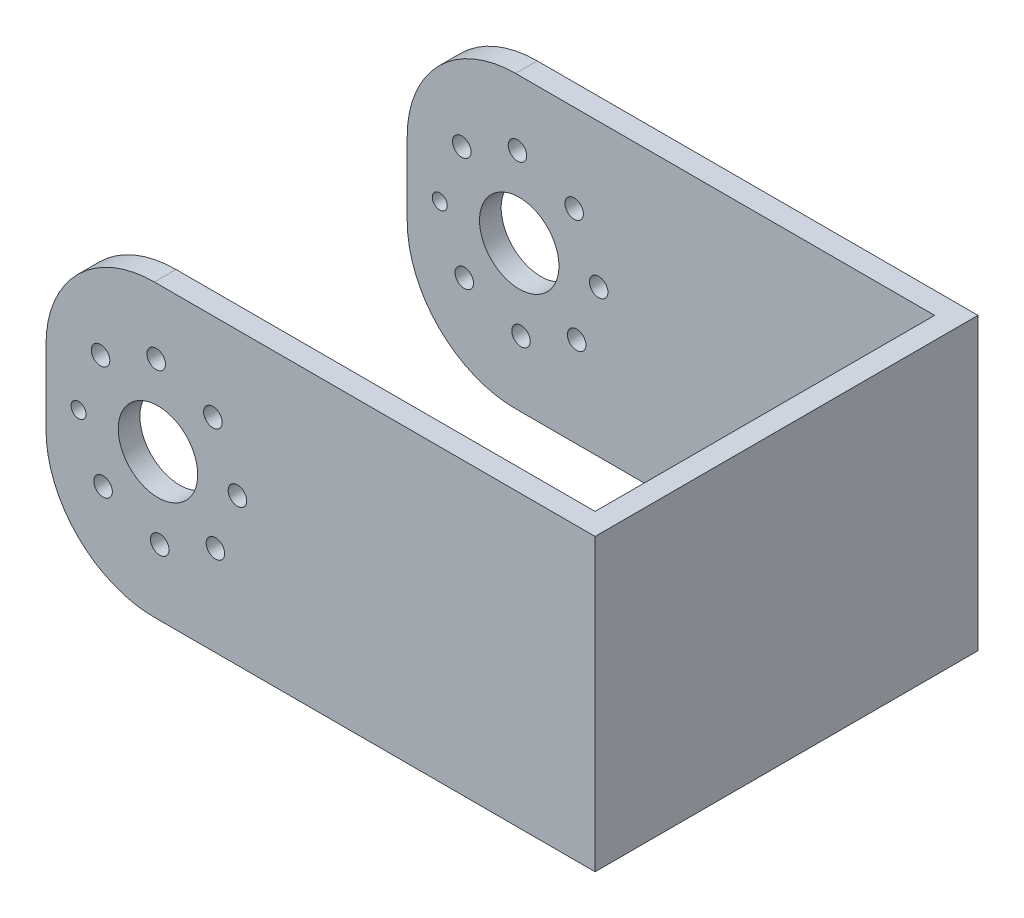
ISO-10303-21;
HEADER;
FILE_DESCRIPTION(('STEP AP214'),'2;1');
FILE_NAME('part.step','',(''),(''),'','','');
FILE_SCHEMA(('AUTOMOTIVE_DESIGN { 1 0 10303 214 1 1 1 1 }'));
ENDSEC;
DATA;
#1=APPLICATION_CONTEXT('core data for automotive mechanical design processes');
#2=APPLICATION_PROTOCOL_DEFINITION('international standard','automotive_design',2000,#1);
#3=PRODUCT_CONTEXT('',#1,'mechanical');
#4=PRODUCT('Part','Part','',(#3));
#5=PRODUCT_RELATED_PRODUCT_CATEGORY('part','',(#4));
#6=PRODUCT_DEFINITION_FORMATION('','',#4);
#7=PRODUCT_DEFINITION_CONTEXT('part definition',#1,'design');
#8=PRODUCT_DEFINITION('design','',#6,#7);
#9=PRODUCT_DEFINITION_SHAPE('','',#8);
#10=(LENGTH_UNIT() NAMED_UNIT(*) SI_UNIT(.MILLI.,.METRE.));
#11=(NAMED_UNIT(*) PLANE_ANGLE_UNIT() SI_UNIT($,.RADIAN.));
#12=(NAMED_UNIT(*) SI_UNIT($,.STERADIAN.) SOLID_ANGLE_UNIT());
#13=UNCERTAINTY_MEASURE_WITH_UNIT(LENGTH_MEASURE(1.E-05),#10,'distance_accuracy_value','');
#14=(GEOMETRIC_REPRESENTATION_CONTEXT(3) GLOBAL_UNCERTAINTY_ASSIGNED_CONTEXT((#13)) GLOBAL_UNIT_ASSIGNED_CONTEXT((#10,
#11,#12)) REPRESENTATION_CONTEXT('',''));
#15=CARTESIAN_POINT('',(0.,0.,0.));
#16=DIRECTION('',(0.,0.,1.));
#17=DIRECTION('',(1.,0.,0.));
#18=AXIS2_PLACEMENT_3D('',#15,#16,#17);
#19=CARTESIAN_POINT('',(0.,40.2,-50.));
#20=DIRECTION('',(0.,0.,1.));
#21=DIRECTION('',(1.,0.,0.));
#22=AXIS2_PLACEMENT_3D('',#19,#20,#21);
#23=PLANE('',#22);
#24=CARTESIAN_POINT('',(15.7463592375308,9.10275911302772,-50.));
#25=DIRECTION('',(0.,0.,1.));
#26=DIRECTION('',(1.,0.,0.));
#27=AXIS2_PLACEMENT_3D('',#24,#25,#26);
#28=CIRCLE('',#27,1.28124999996223);
#29=CARTESIAN_POINT('',(17.027609237493,9.10275911302772,-50.));
#30=VERTEX_POINT('',#29);
#31=EDGE_CURVE('E396',#30,#30,#28,.T.);
#32=ORIENTED_EDGE('',*,*,#31,.F.);
#33=EDGE_LOOP('',(#32));
#34=FACE_BOUND('',#33,.T.);
#35=CARTESIAN_POINT('',(26.4972408869719,20.3463592375301,-50.));
#36=DIRECTION('',(0.,0.,1.));
#37=DIRECTION('',(1.,0.,0.));
#38=AXIS2_PLACEMENT_3D('',#35,#36,#37);
#39=CIRCLE('',#38,1.28124999996223);
#40=CARTESIAN_POINT('',(27.7784908869341,20.3463592375301,-50.));
#41=VERTEX_POINT('',#40);
#42=EDGE_CURVE('E390',#41,#41,#39,.T.);
#43=ORIENTED_EDGE('',*,*,#42,.F.);
#44=EDGE_LOOP('',(#43));
#45=FACE_BOUND('',#44,.T.);
#46=CARTESIAN_POINT('',(23.1020213180539,28.050425892985,-50.));
#47=DIRECTION('',(0.,0.,1.));
#48=DIRECTION('',(1.,0.,0.));
#49=AXIS2_PLACEMENT_3D('',#46,#47,#48);
#50=CIRCLE('',#49,1.28124999996223);
#51=CARTESIAN_POINT('',(24.3832713180162,28.050425892985,-50.));
#52=VERTEX_POINT('',#51);
#53=EDGE_CURVE('E384',#52,#52,#50,.T.);
#54=ORIENTED_EDGE('',*,*,#53,.F.);
#55=EDGE_LOOP('',(#54));
#56=FACE_BOUND('',#55,.T.);
#57=CARTESIAN_POINT('',(15.2536407624695,31.0972408869712,-50.));
#58=DIRECTION('',(0.,0.,1.));
#59=DIRECTION('',(1.,0.,0.));
#60=AXIS2_PLACEMENT_3D('',#57,#58,#59);
#61=CIRCLE('',#60,1.28124999996224);
#62=CARTESIAN_POINT('',(16.5348907624317,31.0972408869712,-50.));
#63=VERTEX_POINT('',#62);
#64=EDGE_CURVE('E378',#63,#63,#61,.T.);
#65=ORIENTED_EDGE('',*,*,#64,.F.);
#66=EDGE_LOOP('',(#65));
#67=FACE_BOUND('',#66,.T.);
#68=CARTESIAN_POINT('',(7.89797868194635,12.1495741070139,-50.));
#69=DIRECTION('',(0.,0.,1.));
#70=DIRECTION('',(1.,0.,0.));
#71=AXIS2_PLACEMENT_3D('',#68,#69,#70);
#72=CIRCLE('',#71,1.28124999996223);
#73=CARTESIAN_POINT('',(9.17922868190858,12.1495741070139,-50.));
#74=VERTEX_POINT('',#73);
#75=EDGE_CURVE('E372',#74,#74,#72,.T.);
#76=ORIENTED_EDGE('',*,*,#75,.F.);
#77=EDGE_LOOP('',(#76));
#78=FACE_BOUND('',#77,.T.);
#79=CARTESIAN_POINT('',(4.50275911302839,19.6078403753859,-50.));
#80=DIRECTION('',(0.,0.,1.));
#81=DIRECTION('',(1.,0.,0.));
#82=AXIS2_PLACEMENT_3D('',#79,#80,#81);
#83=CIRCLE('',#82,1.03544961287929);
#84=CARTESIAN_POINT('',(5.53820872590768,19.6078403753859,-50.));
#85=VERTEX_POINT('',#84);
#86=EDGE_CURVE('E366',#85,#85,#83,.T.);
#87=ORIENTED_EDGE('',*,*,#86,.F.);
#88=EDGE_LOOP('',(#87));
#89=FACE_BOUND('',#88,.T.);
#90=CARTESIAN_POINT('',(7.54957410701459,27.7020213180533,-50.));
#91=DIRECTION('',(0.,0.,1.));
#92=DIRECTION('',(1.,0.,0.));
#93=AXIS2_PLACEMENT_3D('',#90,#91,#92);
#94=CIRCLE('',#93,1.28124999996223);
#95=CARTESIAN_POINT('',(8.83082410697682,27.7020213180533,-50.));
#96=VERTEX_POINT('',#95);
#97=EDGE_CURVE('E360',#96,#96,#94,.T.);
#98=ORIENTED_EDGE('',*,*,#97,.F.);
#99=EDGE_LOOP('',(#98));
#100=FACE_BOUND('',#99,.T.);
#101=CARTESIAN_POINT('',(23.4504258929857,12.4979786819457,-50.));
#102=DIRECTION('',(0.,0.,1.));
#103=DIRECTION('',(1.,0.,0.));
#104=AXIS2_PLACEMENT_3D('',#101,#102,#103);
#105=CIRCLE('',#104,1.28124999996223);
#106=CARTESIAN_POINT('',(24.7316758929479,12.4979786819457,-50.));
#107=VERTEX_POINT('',#106);
#108=EDGE_CURVE('E354',#107,#107,#105,.T.);
#109=ORIENTED_EDGE('',*,*,#108,.F.);
#110=EDGE_LOOP('',(#109));
#111=FACE_BOUND('',#110,.T.);
#112=CARTESIAN_POINT('',(15.5,20.1,-50.));
#113=DIRECTION('',(0.,0.,1.));
#114=DIRECTION('',(1.,0.,0.));
#115=AXIS2_PLACEMENT_3D('',#112,#113,#114);
#116=CIRCLE('',#115,5.5);
#117=CARTESIAN_POINT('',(21.,20.1,-50.));
#118=VERTEX_POINT('',#117);
#119=EDGE_CURVE('E168',#118,#118,#116,.T.);
#120=ORIENTED_EDGE('',*,*,#119,.F.);
#121=EDGE_LOOP('',(#120));
#122=FACE_BOUND('',#121,.T.);
#123=DIRECTION('',(0.,-1.,0.));
#124=VECTOR('',#123,1.);
#125=CARTESIAN_POINT('',(0.,40.2,-50.));
#126=LINE('',#125,#124);
#127=CARTESIAN_POINT('',(0.,25.2,-50.));
#128=VERTEX_POINT('',#127);
#129=CARTESIAN_POINT('',(0.,15.,-50.));
#130=VERTEX_POINT('',#129);
#131=EDGE_CURVE('E165',#128,#130,#126,.T.);
#132=ORIENTED_EDGE('',*,*,#131,.T.);
#133=CARTESIAN_POINT('',(15.,15.,-50.));
#134=DIRECTION('',(0.,0.,1.));
#135=DIRECTION('',(1.,0.,0.));
#136=AXIS2_PLACEMENT_3D('',#133,#134,#135);
#137=CIRCLE('',#136,15.);
#138=CARTESIAN_POINT('',(15.,0.,-50.));
#139=VERTEX_POINT('',#138);
#140=EDGE_CURVE('E219',#130,#139,#137,.T.);
#141=ORIENTED_EDGE('',*,*,#140,.T.);
#142=DIRECTION('',(-1.,0.,0.));
#143=VECTOR('',#142,1.);
#144=CARTESIAN_POINT('',(0.,0.,-50.));
#145=LINE('',#144,#143);
#146=CARTESIAN_POINT('',(73.,0.,-50.));
#147=VERTEX_POINT('',#146);
#148=EDGE_CURVE('E132',#147,#139,#145,.T.);
#149=ORIENTED_EDGE('',*,*,#148,.F.);
#150=DIRECTION('',(0.,-1.,0.));
#151=VECTOR('',#150,1.);
#152=CARTESIAN_POINT('',(73.,40.2,-50.));
#153=LINE('',#152,#151);
#154=CARTESIAN_POINT('',(73.,40.2,-50.));
#155=VERTEX_POINT('',#154);
#156=EDGE_CURVE('E127',#155,#147,#153,.T.);
#157=ORIENTED_EDGE('',*,*,#156,.F.);
#158=DIRECTION('',(-1.,0.,0.));
#159=VECTOR('',#158,1.);
#160=CARTESIAN_POINT('',(0.,40.2,-50.));
#161=LINE('',#160,#159);
#162=CARTESIAN_POINT('',(15.,40.2,-50.));
#163=VERTEX_POINT('',#162);
#164=EDGE_CURVE('E130',#155,#163,#161,.T.);
#165=ORIENTED_EDGE('',*,*,#164,.T.);
#166=CARTESIAN_POINT('',(15.,25.2,-50.));
#167=DIRECTION('',(0.,0.,1.));
#168=DIRECTION('',(1.,0.,0.));
#169=AXIS2_PLACEMENT_3D('',#166,#167,#168);
#170=CIRCLE('',#169,15.);
#171=EDGE_CURVE('E217',#163,#128,#170,.T.);
#172=ORIENTED_EDGE('',*,*,#171,.T.);
#173=EDGE_LOOP('',(#132,#141,#149,#157,#165,#172));
#174=FACE_BOUND('',#173,.T.);
#175=ADVANCED_FACE('F38',(#34,#45,#56,#67,#78,#89,#100,#111,#122,#174),#23,.T.);
#176=CARTESIAN_POINT('',(73.,40.2,0.));
#177=DIRECTION('',(-1.,0.,0.));
#178=DIRECTION('',(0.,0.,1.));
#179=AXIS2_PLACEMENT_3D('',#176,#177,#178);
#180=PLANE('',#179);
#181=DIRECTION('',(0.,0.,-1.));
#182=VECTOR('',#181,1.);
#183=CARTESIAN_POINT('',(73.,0.,0.));
#184=LINE('',#183,#182);
#185=CARTESIAN_POINT('',(73.,0.,-3.));
#186=VERTEX_POINT('',#185);
#187=EDGE_CURVE('E167',#186,#147,#184,.T.);
#188=ORIENTED_EDGE('',*,*,#187,.F.);
#189=DIRECTION('',(0.,-1.,0.));
#190=VECTOR('',#189,1.);
#191=CARTESIAN_POINT('',(73.,40.2,-3.));
#192=LINE('',#191,#190);
#193=CARTESIAN_POINT('',(73.,40.2,-3.));
#194=VERTEX_POINT('',#193);
#195=EDGE_CURVE('E138',#194,#186,#192,.T.);
#196=ORIENTED_EDGE('',*,*,#195,.F.);
#197=DIRECTION('',(0.,0.,-1.));
#198=VECTOR('',#197,1.);
#199=CARTESIAN_POINT('',(73.,40.2,0.));
#200=LINE('',#199,#198);
#201=EDGE_CURVE('E145',#194,#155,#200,.T.);
#202=ORIENTED_EDGE('',*,*,#201,.T.);
#203=ORIENTED_EDGE('',*,*,#156,.T.);
#204=EDGE_LOOP('',(#188,#196,#202,#203));
#205=FACE_BOUND('',#204,.T.);
#206=ADVANCED_FACE('F152',(#205),#180,.T.);
#207=CARTESIAN_POINT('',(0.,40.2,-3.));
#208=DIRECTION('',(0.,0.,-1.));
#209=DIRECTION('',(-1.,0.,0.));
#210=AXIS2_PLACEMENT_3D('',#207,#208,#209);
#211=PLANE('',#210);
#212=CARTESIAN_POINT('',(15.7463592375308,9.10275911302772,-3.));
#213=DIRECTION('',(0.,0.,-1.));
#214=DIRECTION('',(-1.,0.,0.));
#215=AXIS2_PLACEMENT_3D('',#212,#213,#214);
#216=CIRCLE('',#215,1.28124999996223);
#217=CARTESIAN_POINT('',(14.4651092375686,9.10275911302772,-3.));
#218=VERTEX_POINT('',#217);
#219=EDGE_CURVE('E393',#218,#218,#216,.T.);
#220=ORIENTED_EDGE('',*,*,#219,.F.);
#221=EDGE_LOOP('',(#220));
#222=FACE_BOUND('',#221,.T.);
#223=CARTESIAN_POINT('',(26.4972408869719,20.3463592375301,-3.));
#224=DIRECTION('',(0.,0.,-1.));
#225=DIRECTION('',(-1.,0.,0.));
#226=AXIS2_PLACEMENT_3D('',#223,#224,#225);
#227=CIRCLE('',#226,1.28124999996223);
#228=CARTESIAN_POINT('',(25.2159908870097,20.3463592375301,-3.));
#229=VERTEX_POINT('',#228);
#230=EDGE_CURVE('E387',#229,#229,#227,.T.);
#231=ORIENTED_EDGE('',*,*,#230,.F.);
#232=EDGE_LOOP('',(#231));
#233=FACE_BOUND('',#232,.T.);
#234=CARTESIAN_POINT('',(23.1020213180539,28.050425892985,-3.));
#235=DIRECTION('',(0.,0.,-1.));
#236=DIRECTION('',(-1.,0.,0.));
#237=AXIS2_PLACEMENT_3D('',#234,#235,#236);
#238=CIRCLE('',#237,1.28124999996223);
#239=CARTESIAN_POINT('',(21.8207713180917,28.050425892985,-3.));
#240=VERTEX_POINT('',#239);
#241=EDGE_CURVE('E381',#240,#240,#238,.T.);
#242=ORIENTED_EDGE('',*,*,#241,.F.);
#243=EDGE_LOOP('',(#242));
#244=FACE_BOUND('',#243,.T.);
#245=CARTESIAN_POINT('',(15.2536407624695,31.0972408869712,-3.));
#246=DIRECTION('',(0.,0.,-1.));
#247=DIRECTION('',(-1.,0.,0.));
#248=AXIS2_PLACEMENT_3D('',#245,#246,#247);
#249=CIRCLE('',#248,1.28124999996224);
#250=CARTESIAN_POINT('',(13.9723907625072,31.0972408869712,-3.));
#251=VERTEX_POINT('',#250);
#252=EDGE_CURVE('E375',#251,#251,#249,.T.);
#253=ORIENTED_EDGE('',*,*,#252,.F.);
#254=EDGE_LOOP('',(#253));
#255=FACE_BOUND('',#254,.T.);
#256=CARTESIAN_POINT('',(7.89797868194635,12.1495741070139,-3.));
#257=DIRECTION('',(0.,0.,-1.));
#258=DIRECTION('',(-1.,0.,0.));
#259=AXIS2_PLACEMENT_3D('',#256,#257,#258);
#260=CIRCLE('',#259,1.28124999996223);
#261=CARTESIAN_POINT('',(6.61672868198412,12.1495741070139,-3.));
#262=VERTEX_POINT('',#261);
#263=EDGE_CURVE('E369',#262,#262,#260,.T.);
#264=ORIENTED_EDGE('',*,*,#263,.F.);
#265=EDGE_LOOP('',(#264));
#266=FACE_BOUND('',#265,.T.);
#267=CARTESIAN_POINT('',(4.50275911302839,19.6078403753859,-3.));
#268=DIRECTION('',(0.,0.,-1.));
#269=DIRECTION('',(-1.,0.,0.));
#270=AXIS2_PLACEMENT_3D('',#267,#268,#269);
#271=CIRCLE('',#270,1.03544961287929);
#272=CARTESIAN_POINT('',(3.46730950014909,19.6078403753859,-3.));
#273=VERTEX_POINT('',#272);
#274=EDGE_CURVE('E363',#273,#273,#271,.T.);
#275=ORIENTED_EDGE('',*,*,#274,.F.);
#276=EDGE_LOOP('',(#275));
#277=FACE_BOUND('',#276,.T.);
#278=CARTESIAN_POINT('',(7.54957410701459,27.7020213180533,-3.));
#279=DIRECTION('',(0.,0.,-1.));
#280=DIRECTION('',(-1.,0.,0.));
#281=AXIS2_PLACEMENT_3D('',#278,#279,#280);
#282=CIRCLE('',#281,1.28124999996223);
#283=CARTESIAN_POINT('',(6.26832410705236,27.7020213180533,-3.));
#284=VERTEX_POINT('',#283);
#285=EDGE_CURVE('E357',#284,#284,#282,.T.);
#286=ORIENTED_EDGE('',*,*,#285,.F.);
#287=EDGE_LOOP('',(#286));
#288=FACE_BOUND('',#287,.T.);
#289=CARTESIAN_POINT('',(23.4504258929857,12.4979786819457,-3.));
#290=DIRECTION('',(0.,0.,-1.));
#291=DIRECTION('',(-1.,0.,0.));
#292=AXIS2_PLACEMENT_3D('',#289,#290,#291);
#293=CIRCLE('',#292,1.28124999996223);
#294=CARTESIAN_POINT('',(22.1691758930235,12.4979786819457,-3.));
#295=VERTEX_POINT('',#294);
#296=EDGE_CURVE('E322',#295,#295,#293,.T.);
#297=ORIENTED_EDGE('',*,*,#296,.F.);
#298=EDGE_LOOP('',(#297));
#299=FACE_BOUND('',#298,.T.);
#300=CARTESIAN_POINT('',(15.5,20.1,-3.));
#301=DIRECTION('',(0.,0.,-1.));
#302=DIRECTION('',(-1.,0.,0.));
#303=AXIS2_PLACEMENT_3D('',#300,#301,#302);
#304=CIRCLE('',#303,5.5);
#305=CARTESIAN_POINT('',(10.,20.1,-3.));
#306=VERTEX_POINT('',#305);
#307=EDGE_CURVE('E405',#306,#306,#304,.T.);
#308=ORIENTED_EDGE('',*,*,#307,.F.);
#309=EDGE_LOOP('',(#308));
#310=FACE_BOUND('',#309,.T.);
#311=DIRECTION('',(1.,0.,0.));
#312=VECTOR('',#311,1.);
#313=CARTESIAN_POINT('',(0.,0.,-3.));
#314=LINE('',#313,#312);
#315=CARTESIAN_POINT('',(15.,0.,-3.));
#316=VERTEX_POINT('',#315);
#317=EDGE_CURVE('E170',#316,#186,#314,.T.);
#318=ORIENTED_EDGE('',*,*,#317,.F.);
#319=CARTESIAN_POINT('',(15.,15.,-3.));
#320=DIRECTION('',(0.,0.,-1.));
#321=DIRECTION('',(-1.,0.,0.));
#322=AXIS2_PLACEMENT_3D('',#319,#320,#321);
#323=CIRCLE('',#322,15.);
#324=CARTESIAN_POINT('',(0.,15.,-3.));
#325=VERTEX_POINT('',#324);
#326=EDGE_CURVE('E207',#316,#325,#323,.T.);
#327=ORIENTED_EDGE('',*,*,#326,.T.);
#328=DIRECTION('',(0.,-1.,0.));
#329=VECTOR('',#328,1.);
#330=CARTESIAN_POINT('',(0.,40.2,-3.));
#331=LINE('',#330,#329);
#332=CARTESIAN_POINT('',(0.,25.2,-3.));
#333=VERTEX_POINT('',#332);
#334=EDGE_CURVE('E189',#333,#325,#331,.T.);
#335=ORIENTED_EDGE('',*,*,#334,.F.);
#336=CARTESIAN_POINT('',(15.,25.2,-3.));
#337=DIRECTION('',(0.,0.,-1.));
#338=DIRECTION('',(-1.,0.,0.));
#339=AXIS2_PLACEMENT_3D('',#336,#337,#338);
#340=CIRCLE('',#339,15.);
#341=CARTESIAN_POINT('',(15.,40.2,-3.));
#342=VERTEX_POINT('',#341);
#343=EDGE_CURVE('E205',#333,#342,#340,.T.);
#344=ORIENTED_EDGE('',*,*,#343,.T.);
#345=DIRECTION('',(1.,0.,0.));
#346=VECTOR('',#345,1.);
#347=CARTESIAN_POINT('',(0.,40.2,-3.));
#348=LINE('',#347,#346);
#349=EDGE_CURVE('E154',#342,#194,#348,.T.);
#350=ORIENTED_EDGE('',*,*,#349,.T.);
#351=ORIENTED_EDGE('',*,*,#195,.T.);
#352=EDGE_LOOP('',(#318,#327,#335,#344,#350,#351));
#353=FACE_BOUND('',#352,.T.);
#354=ADVANCED_FACE('F239',(#222,#233,#244,#255,#266,#277,#288,#299,#310,#353),#211,.T.);
#355=CARTESIAN_POINT('',(0.,40.2,0.));
#356=DIRECTION('',(1.,0.,0.));
#357=DIRECTION('',(0.,0.,-1.));
#358=AXIS2_PLACEMENT_3D('',#355,#356,#357);
#359=PLANE('',#358);
#360=ORIENTED_EDGE('',*,*,#334,.T.);
#361=DIRECTION('',(0.,0.,1.));
#362=VECTOR('',#361,1.);
#363=CARTESIAN_POINT('',(0.,15.,0.));
#364=LINE('',#363,#362);
#365=CARTESIAN_POINT('',(0.,15.,0.));
#366=VERTEX_POINT('',#365);
#367=EDGE_CURVE('E194',#325,#366,#364,.T.);
#368=ORIENTED_EDGE('',*,*,#367,.T.);
#369=DIRECTION('',(0.,-1.,0.));
#370=VECTOR('',#369,1.);
#371=CARTESIAN_POINT('',(0.,40.2,0.));
#372=LINE('',#371,#370);
#373=CARTESIAN_POINT('',(0.,25.2,0.));
#374=VERTEX_POINT('',#373);
#375=EDGE_CURVE('E186',#374,#366,#372,.T.);
#376=ORIENTED_EDGE('',*,*,#375,.F.);
#377=DIRECTION('',(0.,0.,1.));
#378=VECTOR('',#377,1.);
#379=CARTESIAN_POINT('',(0.,25.2,-3.));
#380=LINE('',#379,#378);
#381=EDGE_CURVE('E137',#374,#333,#380,.F.);
#382=ORIENTED_EDGE('',*,*,#381,.T.);
#383=EDGE_LOOP('',(#360,#368,#376,#382));
#384=FACE_BOUND('',#383,.T.);
#385=ADVANCED_FACE('F252',(#384),#359,.F.);
#386=CARTESIAN_POINT('',(0.,40.2,0.));
#387=DIRECTION('',(0.,0.,-1.));
#388=DIRECTION('',(-1.,0.,0.));
#389=AXIS2_PLACEMENT_3D('',#386,#387,#388);
#390=PLANE('',#389);
#391=CARTESIAN_POINT('',(15.7463592375308,9.10275911302772,0.));
#392=DIRECTION('',(0.,0.,1.));
#393=DIRECTION('',(1.,0.,0.));
#394=AXIS2_PLACEMENT_3D('',#391,#392,#393);
#395=CIRCLE('',#394,1.28124999996223);
#396=CARTESIAN_POINT('',(17.027609237493,9.10275911302772,0.));
#397=VERTEX_POINT('',#396);
#398=EDGE_CURVE('E347',#397,#397,#395,.T.);
#399=ORIENTED_EDGE('',*,*,#398,.F.);
#400=EDGE_LOOP('',(#399));
#401=FACE_BOUND('',#400,.T.);
#402=CARTESIAN_POINT('',(26.4972408869719,20.3463592375301,0.));
#403=DIRECTION('',(0.,0.,1.));
#404=DIRECTION('',(1.,0.,0.));
#405=AXIS2_PLACEMENT_3D('',#402,#403,#404);
#406=CIRCLE('',#405,1.28124999996223);
#407=CARTESIAN_POINT('',(27.7784908869341,20.3463592375301,0.));
#408=VERTEX_POINT('',#407);
#409=EDGE_CURVE('E466',#408,#408,#406,.T.);
#410=ORIENTED_EDGE('',*,*,#409,.F.);
#411=EDGE_LOOP('',(#410));
#412=FACE_BOUND('',#411,.T.);
#413=CARTESIAN_POINT('',(23.1020213180539,28.050425892985,0.));
#414=DIRECTION('',(0.,0.,1.));
#415=DIRECTION('',(1.,0.,0.));
#416=AXIS2_PLACEMENT_3D('',#413,#414,#415);
#417=CIRCLE('',#416,1.28124999996223);
#418=CARTESIAN_POINT('',(24.3832713180162,28.050425892985,0.));
#419=VERTEX_POINT('',#418);
#420=EDGE_CURVE('E465',#419,#419,#417,.T.);
#421=ORIENTED_EDGE('',*,*,#420,.F.);
#422=EDGE_LOOP('',(#421));
#423=FACE_BOUND('',#422,.T.);
#424=CARTESIAN_POINT('',(15.2536407624695,31.0972408869712,0.));
#425=DIRECTION('',(0.,0.,1.));
#426=DIRECTION('',(1.,0.,0.));
#427=AXIS2_PLACEMENT_3D('',#424,#425,#426);
#428=CIRCLE('',#427,1.28124999996224);
#429=CARTESIAN_POINT('',(16.5348907624317,31.0972408869712,0.));
#430=VERTEX_POINT('',#429);
#431=EDGE_CURVE('E334',#430,#430,#428,.T.);
#432=ORIENTED_EDGE('',*,*,#431,.F.);
#433=EDGE_LOOP('',(#432));
#434=FACE_BOUND('',#433,.T.);
#435=CARTESIAN_POINT('',(7.89797868194635,12.1495741070139,0.));
#436=DIRECTION('',(0.,0.,1.));
#437=DIRECTION('',(1.,0.,0.));
#438=AXIS2_PLACEMENT_3D('',#435,#436,#437);
#439=CIRCLE('',#438,1.28124999996223);
#440=CARTESIAN_POINT('',(9.17922868190858,12.1495741070139,0.));
#441=VERTEX_POINT('',#440);
#442=EDGE_CURVE('E340',#441,#441,#439,.T.);
#443=ORIENTED_EDGE('',*,*,#442,.F.);
#444=EDGE_LOOP('',(#443));
#445=FACE_BOUND('',#444,.T.);
#446=CARTESIAN_POINT('',(4.50275911302839,19.6078403753859,0.));
#447=DIRECTION('',(0.,0.,1.));
#448=DIRECTION('',(1.,0.,0.));
#449=AXIS2_PLACEMENT_3D('',#446,#447,#448);
#450=CIRCLE('',#449,1.03544961287929);
#451=CARTESIAN_POINT('',(5.53820872590768,19.6078403753859,0.));
#452=VERTEX_POINT('',#451);
#453=EDGE_CURVE('E348',#452,#452,#450,.T.);
#454=ORIENTED_EDGE('',*,*,#453,.F.);
#455=EDGE_LOOP('',(#454));
#456=FACE_BOUND('',#455,.T.);
#457=CARTESIAN_POINT('',(7.54957410701459,27.7020213180533,0.));
#458=DIRECTION('',(0.,0.,1.));
#459=DIRECTION('',(1.,0.,0.));
#460=AXIS2_PLACEMENT_3D('',#457,#458,#459);
#461=CIRCLE('',#460,1.28124999996223);
#462=CARTESIAN_POINT('',(8.83082410697682,27.7020213180533,0.));
#463=VERTEX_POINT('',#462);
#464=EDGE_CURVE('E331',#463,#463,#461,.T.);
#465=ORIENTED_EDGE('',*,*,#464,.F.);
#466=EDGE_LOOP('',(#465));
#467=FACE_BOUND('',#466,.T.);
#468=CARTESIAN_POINT('',(23.4504258929857,12.4979786819457,0.));
#469=DIRECTION('',(0.,0.,1.));
#470=DIRECTION('',(1.,0.,0.));
#471=AXIS2_PLACEMENT_3D('',#468,#469,#470);
#472=CIRCLE('',#471,1.28124999996223);
#473=CARTESIAN_POINT('',(24.7316758929479,12.4979786819457,0.));
#474=VERTEX_POINT('',#473);
#475=EDGE_CURVE('E325',#474,#474,#472,.T.);
#476=ORIENTED_EDGE('',*,*,#475,.F.);
#477=EDGE_LOOP('',(#476));
#478=FACE_BOUND('',#477,.T.);
#479=CARTESIAN_POINT('',(15.5,20.1,0.));
#480=DIRECTION('',(0.,0.,-1.));
#481=DIRECTION('',(-1.,0.,0.));
#482=AXIS2_PLACEMENT_3D('',#479,#480,#481);
#483=CIRCLE('',#482,5.5);
#484=CARTESIAN_POINT('',(10.,20.1,0.));
#485=VERTEX_POINT('',#484);
#486=EDGE_CURVE('E402',#485,#485,#483,.T.);
#487=ORIENTED_EDGE('',*,*,#486,.T.);
#488=EDGE_LOOP('',(#487));
#489=FACE_BOUND('',#488,.T.);
#490=ORIENTED_EDGE('',*,*,#375,.T.);
#491=CARTESIAN_POINT('',(15.,15.,0.));
#492=DIRECTION('',(0.,0.,-1.));
#493=DIRECTION('',(-1.,0.,0.));
#494=AXIS2_PLACEMENT_3D('',#491,#492,#493);
#495=CIRCLE('',#494,15.);
#496=CARTESIAN_POINT('',(15.,0.,0.));
#497=VERTEX_POINT('',#496);
#498=EDGE_CURVE('E199',#366,#497,#495,.F.);
#499=ORIENTED_EDGE('',*,*,#498,.T.);
#500=DIRECTION('',(1.,0.,0.));
#501=VECTOR('',#500,1.);
#502=CARTESIAN_POINT('',(0.,0.,0.));
#503=LINE('',#502,#501);
#504=CARTESIAN_POINT('',(76.,0.,0.));
#505=VERTEX_POINT('',#504);
#506=EDGE_CURVE('E172',#497,#505,#503,.T.);
#507=ORIENTED_EDGE('',*,*,#506,.T.);
#508=DIRECTION('',(0.,-1.,0.));
#509=VECTOR('',#508,1.);
#510=CARTESIAN_POINT('',(76.,40.2,0.));
#511=LINE('',#510,#509);
#512=CARTESIAN_POINT('',(76.,40.2,0.));
#513=VERTEX_POINT('',#512);
#514=EDGE_CURVE('E183',#513,#505,#511,.T.);
#515=ORIENTED_EDGE('',*,*,#514,.F.);
#516=DIRECTION('',(1.,0.,0.));
#517=VECTOR('',#516,1.);
#518=CARTESIAN_POINT('',(0.,40.2,0.));
#519=LINE('',#518,#517);
#520=CARTESIAN_POINT('',(15.,40.2,0.));
#521=VERTEX_POINT('',#520);
#522=EDGE_CURVE('E156',#521,#513,#519,.T.);
#523=ORIENTED_EDGE('',*,*,#522,.F.);
#524=CARTESIAN_POINT('',(15.,25.2,0.));
#525=DIRECTION('',(0.,0.,-1.));
#526=DIRECTION('',(-1.,0.,0.));
#527=AXIS2_PLACEMENT_3D('',#524,#525,#526);
#528=CIRCLE('',#527,15.);
#529=EDGE_CURVE('E197',#521,#374,#528,.F.);
#530=ORIENTED_EDGE('',*,*,#529,.T.);
#531=EDGE_LOOP('',(#490,#499,#507,#515,#523,#530));
#532=FACE_BOUND('',#531,.T.);
#533=ADVANCED_FACE('F249',(#401,#412,#423,#434,#445,#456,#467,#478,#489,#532),#390,.F.);
#534=CARTESIAN_POINT('',(76.,40.2,0.));
#535=DIRECTION('',(-1.,0.,0.));
#536=DIRECTION('',(0.,0.,1.));
#537=AXIS2_PLACEMENT_3D('',#534,#535,#536);
#538=PLANE('',#537);
#539=DIRECTION('',(0.,0.,-1.));
#540=VECTOR('',#539,1.);
#541=CARTESIAN_POINT('',(76.,0.,0.));
#542=LINE('',#541,#540);
#543=CARTESIAN_POINT('',(76.,0.,-53.));
#544=VERTEX_POINT('',#543);
#545=EDGE_CURVE('E174',#505,#544,#542,.T.);
#546=ORIENTED_EDGE('',*,*,#545,.T.);
#547=DIRECTION('',(0.,-1.,0.));
#548=VECTOR('',#547,1.);
#549=CARTESIAN_POINT('',(76.,40.2,-53.));
#550=LINE('',#549,#548);
#551=CARTESIAN_POINT('',(76.,40.2,-53.));
#552=VERTEX_POINT('',#551);
#553=EDGE_CURVE('E180',#552,#544,#550,.T.);
#554=ORIENTED_EDGE('',*,*,#553,.F.);
#555=DIRECTION('',(0.,0.,-1.));
#556=VECTOR('',#555,1.);
#557=CARTESIAN_POINT('',(76.,40.2,0.));
#558=LINE('',#557,#556);
#559=EDGE_CURVE('E161',#513,#552,#558,.T.);
#560=ORIENTED_EDGE('',*,*,#559,.F.);
#561=ORIENTED_EDGE('',*,*,#514,.T.);
#562=EDGE_LOOP('',(#546,#554,#560,#561));
#563=FACE_BOUND('',#562,.T.);
#564=ADVANCED_FACE('F258',(#563),#538,.F.);
#565=CARTESIAN_POINT('',(0.,40.2,-53.));
#566=DIRECTION('',(0.,0.,1.));
#567=DIRECTION('',(1.,0.,0.));
#568=AXIS2_PLACEMENT_3D('',#565,#566,#567);
#569=PLANE('',#568);
#570=CARTESIAN_POINT('',(15.7463592375308,9.10275911302772,-53.));
#571=DIRECTION('',(0.,0.,1.));
#572=DIRECTION('',(1.,0.,0.));
#573=AXIS2_PLACEMENT_3D('',#570,#571,#572);
#574=CIRCLE('',#573,1.28124999996223);
#575=CARTESIAN_POINT('',(17.027609237493,9.10275911302772,-53.));
#576=VERTEX_POINT('',#575);
#577=EDGE_CURVE('E355',#576,#576,#574,.T.);
#578=ORIENTED_EDGE('',*,*,#577,.T.);
#579=EDGE_LOOP('',(#578));
#580=FACE_BOUND('',#579,.T.);
#581=CARTESIAN_POINT('',(26.4972408869719,20.3463592375301,-53.));
#582=DIRECTION('',(0.,0.,1.));
#583=DIRECTION('',(1.,0.,0.));
#584=AXIS2_PLACEMENT_3D('',#581,#582,#583);
#585=CIRCLE('',#584,1.28124999996223);
#586=CARTESIAN_POINT('',(27.7784908869341,20.3463592375301,-53.));
#587=VERTEX_POINT('',#586);
#588=EDGE_CURVE('E462',#587,#587,#585,.T.);
#589=ORIENTED_EDGE('',*,*,#588,.T.);
#590=EDGE_LOOP('',(#589));
#591=FACE_BOUND('',#590,.T.);
#592=CARTESIAN_POINT('',(23.1020213180539,28.050425892985,-53.));
#593=DIRECTION('',(0.,0.,1.));
#594=DIRECTION('',(1.,0.,0.));
#595=AXIS2_PLACEMENT_3D('',#592,#593,#594);
#596=CIRCLE('',#595,1.28124999996223);
#597=CARTESIAN_POINT('',(24.3832713180162,28.050425892985,-53.));
#598=VERTEX_POINT('',#597);
#599=EDGE_CURVE('E469',#598,#598,#596,.T.);
#600=ORIENTED_EDGE('',*,*,#599,.T.);
#601=EDGE_LOOP('',(#600));
#602=FACE_BOUND('',#601,.T.);
#603=CARTESIAN_POINT('',(15.2536407624695,31.0972408869712,-53.));
#604=DIRECTION('',(0.,0.,1.));
#605=DIRECTION('',(1.,0.,0.));
#606=AXIS2_PLACEMENT_3D('',#603,#604,#605);
#607=CIRCLE('',#606,1.28124999996224);
#608=CARTESIAN_POINT('',(16.5348907624317,31.0972408869712,-53.));
#609=VERTEX_POINT('',#608);
#610=EDGE_CURVE('E328',#609,#609,#607,.T.);
#611=ORIENTED_EDGE('',*,*,#610,.T.);
#612=EDGE_LOOP('',(#611));
#613=FACE_BOUND('',#612,.T.);
#614=CARTESIAN_POINT('',(7.89797868194635,12.1495741070139,-53.));
#615=DIRECTION('',(0.,0.,1.));
#616=DIRECTION('',(1.,0.,0.));
#617=AXIS2_PLACEMENT_3D('',#614,#615,#616);
#618=CIRCLE('',#617,1.28124999996223);
#619=CARTESIAN_POINT('',(9.17922868190858,12.1495741070139,-53.));
#620=VERTEX_POINT('',#619);
#621=EDGE_CURVE('E343',#620,#620,#618,.T.);
#622=ORIENTED_EDGE('',*,*,#621,.T.);
#623=EDGE_LOOP('',(#622));
#624=FACE_BOUND('',#623,.T.);
#625=CARTESIAN_POINT('',(4.50275911302839,19.6078403753859,-53.));
#626=DIRECTION('',(0.,0.,1.));
#627=DIRECTION('',(1.,0.,0.));
#628=AXIS2_PLACEMENT_3D('',#625,#626,#627);
#629=CIRCLE('',#628,1.03544961287929);
#630=CARTESIAN_POINT('',(5.53820872590768,19.6078403753859,-53.));
#631=VERTEX_POINT('',#630);
#632=EDGE_CURVE('E344',#631,#631,#629,.T.);
#633=ORIENTED_EDGE('',*,*,#632,.T.);
#634=EDGE_LOOP('',(#633));
#635=FACE_BOUND('',#634,.T.);
#636=CARTESIAN_POINT('',(7.54957410701459,27.7020213180533,-53.));
#637=DIRECTION('',(0.,0.,1.));
#638=DIRECTION('',(1.,0.,0.));
#639=AXIS2_PLACEMENT_3D('',#636,#637,#638);
#640=CIRCLE('',#639,1.28124999996223);
#641=CARTESIAN_POINT('',(8.83082410697682,27.7020213180533,-53.));
#642=VERTEX_POINT('',#641);
#643=EDGE_CURVE('E337',#642,#642,#640,.T.);
#644=ORIENTED_EDGE('',*,*,#643,.T.);
#645=EDGE_LOOP('',(#644));
#646=FACE_BOUND('',#645,.T.);
#647=CARTESIAN_POINT('',(23.4504258929857,12.4979786819457,-53.));
#648=DIRECTION('',(0.,0.,1.));
#649=DIRECTION('',(1.,0.,0.));
#650=AXIS2_PLACEMENT_3D('',#647,#648,#649);
#651=CIRCLE('',#650,1.28124999996223);
#652=CARTESIAN_POINT('',(24.7316758929479,12.4979786819457,-53.));
#653=VERTEX_POINT('',#652);
#654=EDGE_CURVE('E327',#653,#653,#651,.T.);
#655=ORIENTED_EDGE('',*,*,#654,.T.);
#656=EDGE_LOOP('',(#655));
#657=FACE_BOUND('',#656,.T.);
#658=CARTESIAN_POINT('',(15.5,20.1,-53.));
#659=DIRECTION('',(0.,0.,1.));
#660=DIRECTION('',(1.,0.,0.));
#661=AXIS2_PLACEMENT_3D('',#658,#659,#660);
#662=CIRCLE('',#661,5.5);
#663=CARTESIAN_POINT('',(21.,20.1,-53.));
#664=VERTEX_POINT('',#663);
#665=EDGE_CURVE('E399',#664,#664,#662,.T.);
#666=ORIENTED_EDGE('',*,*,#665,.T.);
#667=EDGE_LOOP('',(#666));
#668=FACE_BOUND('',#667,.T.);
#669=DIRECTION('',(-1.,0.,0.));
#670=VECTOR('',#669,1.);
#671=CARTESIAN_POINT('',(0.,0.,-53.));
#672=LINE('',#671,#670);
#673=CARTESIAN_POINT('',(15.,0.,-53.));
#674=VERTEX_POINT('',#673);
#675=EDGE_CURVE('E149',#544,#674,#672,.T.);
#676=ORIENTED_EDGE('',*,*,#675,.T.);
#677=CARTESIAN_POINT('',(15.,15.,-53.));
#678=DIRECTION('',(0.,0.,1.));
#679=DIRECTION('',(1.,0.,0.));
#680=AXIS2_PLACEMENT_3D('',#677,#678,#679);
#681=CIRCLE('',#680,15.);
#682=CARTESIAN_POINT('',(0.,15.,-53.));
#683=VERTEX_POINT('',#682);
#684=EDGE_CURVE('E11',#674,#683,#681,.F.);
#685=ORIENTED_EDGE('',*,*,#684,.T.);
#686=DIRECTION('',(0.,-1.,0.));
#687=VECTOR('',#686,1.);
#688=CARTESIAN_POINT('',(0.,40.2,-53.));
#689=LINE('',#688,#687);
#690=CARTESIAN_POINT('',(0.,25.2,-53.));
#691=VERTEX_POINT('',#690);
#692=EDGE_CURVE('E178',#691,#683,#689,.T.);
#693=ORIENTED_EDGE('',*,*,#692,.F.);
#694=CARTESIAN_POINT('',(15.,25.2,-53.));
#695=DIRECTION('',(0.,0.,1.));
#696=DIRECTION('',(1.,0.,0.));
#697=AXIS2_PLACEMENT_3D('',#694,#695,#696);
#698=CIRCLE('',#697,15.);
#699=CARTESIAN_POINT('',(15.,40.2,-53.));
#700=VERTEX_POINT('',#699);
#701=EDGE_CURVE('E46',#691,#700,#698,.F.);
#702=ORIENTED_EDGE('',*,*,#701,.T.);
#703=DIRECTION('',(-1.,0.,0.));
#704=VECTOR('',#703,1.);
#705=CARTESIAN_POINT('',(0.,40.2,-53.));
#706=LINE('',#705,#704);
#707=EDGE_CURVE('E163',#552,#700,#706,.T.);
#708=ORIENTED_EDGE('',*,*,#707,.F.);
#709=ORIENTED_EDGE('',*,*,#553,.T.);
#710=EDGE_LOOP('',(#676,#685,#693,#702,#708,#709));
#711=FACE_BOUND('',#710,.T.);
#712=ADVANCED_FACE('F222',(#580,#591,#602,#613,#624,#635,#646,#657,#668,#711),#569,.F.);
#713=ORIENTED_EDGE('',*,*,#692,.T.);
#714=DIRECTION('',(0.,0.,1.));
#715=VECTOR('',#714,1.);
#716=CARTESIAN_POINT('',(0.,15.,0.));
#717=LINE('',#716,#715);
#718=EDGE_CURVE('E214',#683,#130,#717,.T.);
#719=ORIENTED_EDGE('',*,*,#718,.T.);
#720=ORIENTED_EDGE('',*,*,#131,.F.);
#721=DIRECTION('',(0.,0.,1.));
#722=VECTOR('',#721,1.);
#723=CARTESIAN_POINT('',(0.,25.2,-53.));
#724=LINE('',#723,#722);
#725=EDGE_CURVE('E58',#128,#691,#724,.F.);
#726=ORIENTED_EDGE('',*,*,#725,.T.);
#727=EDGE_LOOP('',(#713,#719,#720,#726));
#728=FACE_BOUND('',#727,.T.);
#729=ADVANCED_FACE('F226',(#728),#359,.F.);
#730=CARTESIAN_POINT('',(0.,40.2,0.));
#731=DIRECTION('',(0.,1.,0.));
#732=DIRECTION('',(0.,0.,1.));
#733=AXIS2_PLACEMENT_3D('',#730,#731,#732);
#734=PLANE('',#733);
#735=ORIENTED_EDGE('',*,*,#349,.F.);
#736=DIRECTION('',(0.,0.,1.));
#737=VECTOR('',#736,1.);
#738=CARTESIAN_POINT('',(15.,40.2,0.));
#739=LINE('',#738,#737);
#740=EDGE_CURVE('E210',#342,#521,#739,.T.);
#741=ORIENTED_EDGE('',*,*,#740,.T.);
#742=ORIENTED_EDGE('',*,*,#522,.T.);
#743=ORIENTED_EDGE('',*,*,#559,.T.);
#744=ORIENTED_EDGE('',*,*,#707,.T.);
#745=DIRECTION('',(0.,0.,1.));
#746=VECTOR('',#745,1.);
#747=CARTESIAN_POINT('',(15.,40.2,-50.));
#748=LINE('',#747,#746);
#749=EDGE_CURVE('E148',#700,#163,#748,.T.);
#750=ORIENTED_EDGE('',*,*,#749,.T.);
#751=ORIENTED_EDGE('',*,*,#164,.F.);
#752=ORIENTED_EDGE('',*,*,#201,.F.);
#753=EDGE_LOOP('',(#735,#741,#742,#743,#744,#750,#751,#752));
#754=FACE_BOUND('',#753,.T.);
#755=ADVANCED_FACE('F144',(#754),#734,.T.);
#756=CARTESIAN_POINT('',(0.,0.,0.));
#757=DIRECTION('',(0.,1.,0.));
#758=DIRECTION('',(0.,0.,1.));
#759=AXIS2_PLACEMENT_3D('',#756,#757,#758);
#760=PLANE('',#759);
#761=ORIENTED_EDGE('',*,*,#506,.F.);
#762=DIRECTION('',(0.,0.,1.));
#763=VECTOR('',#762,1.);
#764=CARTESIAN_POINT('',(15.,0.,0.));
#765=LINE('',#764,#763);
#766=EDGE_CURVE('E203',#497,#316,#765,.F.);
#767=ORIENTED_EDGE('',*,*,#766,.T.);
#768=ORIENTED_EDGE('',*,*,#317,.T.);
#769=ORIENTED_EDGE('',*,*,#187,.T.);
#770=ORIENTED_EDGE('',*,*,#148,.T.);
#771=DIRECTION('',(0.,0.,1.));
#772=VECTOR('',#771,1.);
#773=CARTESIAN_POINT('',(15.,0.,0.));
#774=LINE('',#773,#772);
#775=EDGE_CURVE('E201',#139,#674,#774,.F.);
#776=ORIENTED_EDGE('',*,*,#775,.T.);
#777=ORIENTED_EDGE('',*,*,#675,.F.);
#778=ORIENTED_EDGE('',*,*,#545,.F.);
#779=EDGE_LOOP('',(#761,#767,#768,#769,#770,#776,#777,#778));
#780=FACE_BOUND('',#779,.T.);
#781=ADVANCED_FACE('F233',(#780),#760,.F.);
#782=CARTESIAN_POINT('',(15.5,20.1,-53.));
#783=DIRECTION('',(0.,0.,1.));
#784=DIRECTION('',(1.,0.,0.));
#785=AXIS2_PLACEMENT_3D('',#782,#783,#784);
#786=CYLINDRICAL_SURFACE('',#785,5.5);
#787=ORIENTED_EDGE('',*,*,#119,.T.);
#788=EDGE_LOOP('',(#787));
#789=FACE_BOUND('',#788,.T.);
#790=ORIENTED_EDGE('',*,*,#665,.F.);
#791=EDGE_LOOP('',(#790));
#792=FACE_BOUND('',#791,.T.);
#793=ADVANCED_FACE('F410',(#789,#792),#786,.F.);
#794=ORIENTED_EDGE('',*,*,#307,.T.);
#795=EDGE_LOOP('',(#794));
#796=FACE_BOUND('',#795,.T.);
#797=ORIENTED_EDGE('',*,*,#486,.F.);
#798=EDGE_LOOP('',(#797));
#799=FACE_BOUND('',#798,.T.);
#800=ADVANCED_FACE('F282',(#796,#799),#786,.F.);
#801=CARTESIAN_POINT('',(15.,15.,0.));
#802=DIRECTION('',(0.,0.,1.));
#803=DIRECTION('',(1.,0.,0.));
#804=AXIS2_PLACEMENT_3D('',#801,#802,#803);
#805=CYLINDRICAL_SURFACE('',#804,15.);
#806=ORIENTED_EDGE('',*,*,#326,.F.);
#807=ORIENTED_EDGE('',*,*,#766,.F.);
#808=ORIENTED_EDGE('',*,*,#498,.F.);
#809=ORIENTED_EDGE('',*,*,#367,.F.);
#810=EDGE_LOOP('',(#806,#807,#808,#809));
#811=FACE_BOUND('',#810,.T.);
#812=ADVANCED_FACE('F255',(#811),#805,.T.);
#813=CARTESIAN_POINT('',(15.,25.2,0.));
#814=DIRECTION('',(0.,0.,-1.));
#815=DIRECTION('',(-1.,0.,0.));
#816=AXIS2_PLACEMENT_3D('',#813,#814,#815);
#817=CYLINDRICAL_SURFACE('',#816,15.);
#818=ORIENTED_EDGE('',*,*,#343,.F.);
#819=ORIENTED_EDGE('',*,*,#381,.F.);
#820=ORIENTED_EDGE('',*,*,#529,.F.);
#821=ORIENTED_EDGE('',*,*,#740,.F.);
#822=EDGE_LOOP('',(#818,#819,#820,#821));
#823=FACE_BOUND('',#822,.T.);
#824=ADVANCED_FACE('F245',(#823),#817,.T.);
#825=CARTESIAN_POINT('',(15.,15.,0.));
#826=DIRECTION('',(0.,0.,1.));
#827=DIRECTION('',(1.,0.,0.));
#828=AXIS2_PLACEMENT_3D('',#825,#826,#827);
#829=CYLINDRICAL_SURFACE('',#828,15.);
#830=ORIENTED_EDGE('',*,*,#684,.F.);
#831=ORIENTED_EDGE('',*,*,#775,.F.);
#832=ORIENTED_EDGE('',*,*,#140,.F.);
#833=ORIENTED_EDGE('',*,*,#718,.F.);
#834=EDGE_LOOP('',(#830,#831,#832,#833));
#835=FACE_BOUND('',#834,.T.);
#836=ADVANCED_FACE('F229',(#835),#829,.T.);
#837=CARTESIAN_POINT('',(15.,25.2,0.));
#838=DIRECTION('',(0.,0.,-1.));
#839=DIRECTION('',(-1.,0.,0.));
#840=AXIS2_PLACEMENT_3D('',#837,#838,#839);
#841=CYLINDRICAL_SURFACE('',#840,15.);
#842=ORIENTED_EDGE('',*,*,#701,.F.);
#843=ORIENTED_EDGE('',*,*,#725,.F.);
#844=ORIENTED_EDGE('',*,*,#171,.F.);
#845=ORIENTED_EDGE('',*,*,#749,.F.);
#846=EDGE_LOOP('',(#842,#843,#844,#845));
#847=FACE_BOUND('',#846,.T.);
#848=ADVANCED_FACE('F40',(#847),#841,.T.);
#849=CARTESIAN_POINT('',(23.4504258929857,12.4979786819457,-53.));
#850=DIRECTION('',(0.,0.,1.));
#851=DIRECTION('',(1.,0.,0.));
#852=AXIS2_PLACEMENT_3D('',#849,#850,#851);
#853=CYLINDRICAL_SURFACE('',#852,1.28124999996223);
#854=ORIENTED_EDGE('',*,*,#108,.T.);
#855=EDGE_LOOP('',(#854));
#856=FACE_BOUND('',#855,.T.);
#857=ORIENTED_EDGE('',*,*,#654,.F.);
#858=EDGE_LOOP('',(#857));
#859=FACE_BOUND('',#858,.T.);
#860=ADVANCED_FACE('F288',(#856,#859),#853,.F.);
#861=CARTESIAN_POINT('',(7.54957410701459,27.7020213180533,-53.));
#862=DIRECTION('',(0.,0.,1.));
#863=DIRECTION('',(1.,0.,0.));
#864=AXIS2_PLACEMENT_3D('',#861,#862,#863);
#865=CYLINDRICAL_SURFACE('',#864,1.28124999996223);
#866=ORIENTED_EDGE('',*,*,#97,.T.);
#867=EDGE_LOOP('',(#866));
#868=FACE_BOUND('',#867,.T.);
#869=ORIENTED_EDGE('',*,*,#643,.F.);
#870=EDGE_LOOP('',(#869));
#871=FACE_BOUND('',#870,.T.);
#872=ADVANCED_FACE('F292',(#868,#871),#865,.F.);
#873=CARTESIAN_POINT('',(4.50275911302839,19.6078403753859,-53.));
#874=DIRECTION('',(0.,0.,1.));
#875=DIRECTION('',(1.,0.,0.));
#876=AXIS2_PLACEMENT_3D('',#873,#874,#875);
#877=CYLINDRICAL_SURFACE('',#876,1.03544961287929);
#878=ORIENTED_EDGE('',*,*,#86,.T.);
#879=EDGE_LOOP('',(#878));
#880=FACE_BOUND('',#879,.T.);
#881=ORIENTED_EDGE('',*,*,#632,.F.);
#882=EDGE_LOOP('',(#881));
#883=FACE_BOUND('',#882,.T.);
#884=ADVANCED_FACE('F299',(#880,#883),#877,.F.);
#885=CARTESIAN_POINT('',(7.89797868194635,12.1495741070139,-53.));
#886=DIRECTION('',(0.,0.,1.));
#887=DIRECTION('',(1.,0.,0.));
#888=AXIS2_PLACEMENT_3D('',#885,#886,#887);
#889=CYLINDRICAL_SURFACE('',#888,1.28124999996223);
#890=ORIENTED_EDGE('',*,*,#75,.T.);
#891=EDGE_LOOP('',(#890));
#892=FACE_BOUND('',#891,.T.);
#893=ORIENTED_EDGE('',*,*,#621,.F.);
#894=EDGE_LOOP('',(#893));
#895=FACE_BOUND('',#894,.T.);
#896=ADVANCED_FACE('F500',(#892,#895),#889,.F.);
#897=CARTESIAN_POINT('',(15.2536407624695,31.0972408869712,-53.));
#898=DIRECTION('',(0.,0.,1.));
#899=DIRECTION('',(1.,0.,0.));
#900=AXIS2_PLACEMENT_3D('',#897,#898,#899);
#901=CYLINDRICAL_SURFACE('',#900,1.28124999996224);
#902=ORIENTED_EDGE('',*,*,#64,.T.);
#903=EDGE_LOOP('',(#902));
#904=FACE_BOUND('',#903,.T.);
#905=ORIENTED_EDGE('',*,*,#610,.F.);
#906=EDGE_LOOP('',(#905));
#907=FACE_BOUND('',#906,.T.);
#908=ADVANCED_FACE('F506',(#904,#907),#901,.F.);
#909=CARTESIAN_POINT('',(23.1020213180539,28.050425892985,-53.));
#910=DIRECTION('',(0.,0.,1.));
#911=DIRECTION('',(1.,0.,0.));
#912=AXIS2_PLACEMENT_3D('',#909,#910,#911);
#913=CYLINDRICAL_SURFACE('',#912,1.28124999996223);
#914=ORIENTED_EDGE('',*,*,#53,.T.);
#915=EDGE_LOOP('',(#914));
#916=FACE_BOUND('',#915,.T.);
#917=ORIENTED_EDGE('',*,*,#599,.F.);
#918=EDGE_LOOP('',(#917));
#919=FACE_BOUND('',#918,.T.);
#920=ADVANCED_FACE('F525',(#916,#919),#913,.F.);
#921=CARTESIAN_POINT('',(26.4972408869719,20.3463592375301,-53.));
#922=DIRECTION('',(0.,0.,1.));
#923=DIRECTION('',(1.,0.,0.));
#924=AXIS2_PLACEMENT_3D('',#921,#922,#923);
#925=CYLINDRICAL_SURFACE('',#924,1.28124999996223);
#926=ORIENTED_EDGE('',*,*,#42,.T.);
#927=EDGE_LOOP('',(#926));
#928=FACE_BOUND('',#927,.T.);
#929=ORIENTED_EDGE('',*,*,#588,.F.);
#930=EDGE_LOOP('',(#929));
#931=FACE_BOUND('',#930,.T.);
#932=ADVANCED_FACE('F315',(#928,#931),#925,.F.);
#933=CARTESIAN_POINT('',(15.7463592375308,9.10275911302772,-53.));
#934=DIRECTION('',(0.,0.,1.));
#935=DIRECTION('',(1.,0.,0.));
#936=AXIS2_PLACEMENT_3D('',#933,#934,#935);
#937=CYLINDRICAL_SURFACE('',#936,1.28124999996223);
#938=ORIENTED_EDGE('',*,*,#31,.T.);
#939=EDGE_LOOP('',(#938));
#940=FACE_BOUND('',#939,.T.);
#941=ORIENTED_EDGE('',*,*,#577,.F.);
#942=EDGE_LOOP('',(#941));
#943=FACE_BOUND('',#942,.T.);
#944=ADVANCED_FACE('F307',(#940,#943),#937,.F.);
#945=ORIENTED_EDGE('',*,*,#296,.T.);
#946=EDGE_LOOP('',(#945));
#947=FACE_BOUND('',#946,.T.);
#948=ORIENTED_EDGE('',*,*,#475,.T.);
#949=EDGE_LOOP('',(#948));
#950=FACE_BOUND('',#949,.T.);
#951=ADVANCED_FACE('F295',(#947,#950),#853,.F.);
#952=ORIENTED_EDGE('',*,*,#285,.T.);
#953=EDGE_LOOP('',(#952));
#954=FACE_BOUND('',#953,.T.);
#955=ORIENTED_EDGE('',*,*,#464,.T.);
#956=EDGE_LOOP('',(#955));
#957=FACE_BOUND('',#956,.T.);
#958=ADVANCED_FACE('F302',(#954,#957),#865,.F.);
#959=ORIENTED_EDGE('',*,*,#274,.T.);
#960=EDGE_LOOP('',(#959));
#961=FACE_BOUND('',#960,.T.);
#962=ORIENTED_EDGE('',*,*,#453,.T.);
#963=EDGE_LOOP('',(#962));
#964=FACE_BOUND('',#963,.T.);
#965=ADVANCED_FACE('F313',(#961,#964),#877,.F.);
#966=ORIENTED_EDGE('',*,*,#263,.T.);
#967=EDGE_LOOP('',(#966));
#968=FACE_BOUND('',#967,.T.);
#969=ORIENTED_EDGE('',*,*,#442,.T.);
#970=EDGE_LOOP('',(#969));
#971=FACE_BOUND('',#970,.T.);
#972=ADVANCED_FACE('F493',(#968,#971),#889,.F.);
#973=ORIENTED_EDGE('',*,*,#252,.T.);
#974=EDGE_LOOP('',(#973));
#975=FACE_BOUND('',#974,.T.);
#976=ORIENTED_EDGE('',*,*,#431,.T.);
#977=EDGE_LOOP('',(#976));
#978=FACE_BOUND('',#977,.T.);
#979=ADVANCED_FACE('F498',(#975,#978),#901,.F.);
#980=ORIENTED_EDGE('',*,*,#241,.T.);
#981=EDGE_LOOP('',(#980));
#982=FACE_BOUND('',#981,.T.);
#983=ORIENTED_EDGE('',*,*,#420,.T.);
#984=EDGE_LOOP('',(#983));
#985=FACE_BOUND('',#984,.T.);
#986=ADVANCED_FACE('F538',(#982,#985),#913,.F.);
#987=ORIENTED_EDGE('',*,*,#230,.T.);
#988=EDGE_LOOP('',(#987));
#989=FACE_BOUND('',#988,.T.);
#990=ORIENTED_EDGE('',*,*,#409,.T.);
#991=EDGE_LOOP('',(#990));
#992=FACE_BOUND('',#991,.T.);
#993=ADVANCED_FACE('F545',(#989,#992),#925,.F.);
#994=ORIENTED_EDGE('',*,*,#219,.T.);
#995=EDGE_LOOP('',(#994));
#996=FACE_BOUND('',#995,.T.);
#997=ORIENTED_EDGE('',*,*,#398,.T.);
#998=EDGE_LOOP('',(#997));
#999=FACE_BOUND('',#998,.T.);
#1000=ADVANCED_FACE('F318',(#996,#999),#937,.F.);
#1001=CLOSED_SHELL('',(#175,#206,#354,#385,#533,#564,#712,#729,#755,#781,#793,#800,#812,#824,
#836,#848,#860,#872,#884,#896,#908,#920,#932,#944,#951,#958,#965,#972,#979,#986,#993,#1000));
#1002=MANIFOLD_SOLID_BREP('B2',#1001);
#1003=ADVANCED_BREP_SHAPE_REPRESENTATION('',(#18,#1002),#14);
#1004=SHAPE_DEFINITION_REPRESENTATION(#9,#1003);
ENDSEC;
END-ISO-10303-21;
